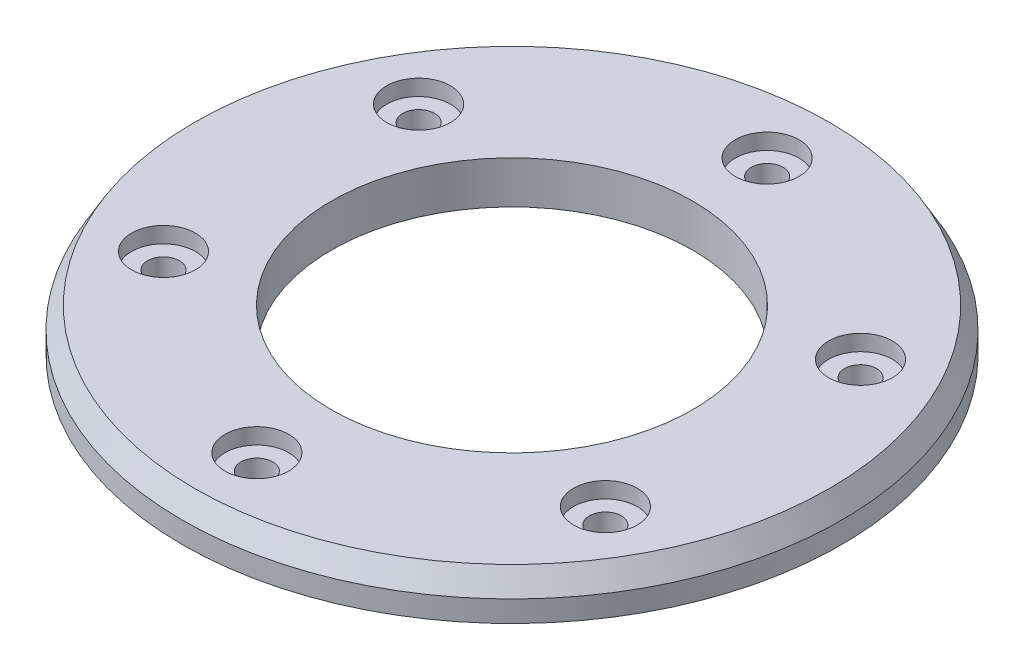
ISO-10303-21;
HEADER;
FILE_DESCRIPTION(('STEP AP214'),'2;1');
FILE_NAME('part.step','',(''),(''),'','','');
FILE_SCHEMA(('AUTOMOTIVE_DESIGN { 1 0 10303 214 1 1 1 1 }'));
ENDSEC;
DATA;
#1=APPLICATION_CONTEXT('core data for automotive mechanical design processes');
#2=APPLICATION_PROTOCOL_DEFINITION('international standard','automotive_design',2000,#1);
#3=PRODUCT_CONTEXT('',#1,'mechanical');
#4=PRODUCT('Part','Part','',(#3));
#5=PRODUCT_RELATED_PRODUCT_CATEGORY('part','',(#4));
#6=PRODUCT_DEFINITION_FORMATION('','',#4);
#7=PRODUCT_DEFINITION_CONTEXT('part definition',#1,'design');
#8=PRODUCT_DEFINITION('design','',#6,#7);
#9=PRODUCT_DEFINITION_SHAPE('','',#8);
#10=(LENGTH_UNIT() NAMED_UNIT(*) SI_UNIT(.MILLI.,.METRE.));
#11=(NAMED_UNIT(*) PLANE_ANGLE_UNIT() SI_UNIT($,.RADIAN.));
#12=(NAMED_UNIT(*) SI_UNIT($,.STERADIAN.) SOLID_ANGLE_UNIT());
#13=UNCERTAINTY_MEASURE_WITH_UNIT(LENGTH_MEASURE(1.E-05),#10,'distance_accuracy_value','');
#14=(GEOMETRIC_REPRESENTATION_CONTEXT(3) GLOBAL_UNCERTAINTY_ASSIGNED_CONTEXT((#13)) GLOBAL_UNIT_ASSIGNED_CONTEXT((#10,
#11,#12)) REPRESENTATION_CONTEXT('',''));
#15=CARTESIAN_POINT('',(0.,0.,0.));
#16=DIRECTION('',(0.,0.,1.));
#17=DIRECTION('',(1.,0.,0.));
#18=AXIS2_PLACEMENT_3D('',#15,#16,#17);
#19=CARTESIAN_POINT('',(0.,4.,-24.));
#20=DIRECTION('',(0.,-1.,0.));
#21=DIRECTION('',(0.,0.,-1.));
#22=AXIS2_PLACEMENT_3D('',#19,#20,#21);
#23=CYLINDRICAL_SURFACE('',#22,1.5);
#24=CARTESIAN_POINT('',(0.,0.,-24.));
#25=DIRECTION('',(0.,1.,0.));
#26=DIRECTION('',(0.,0.,1.));
#27=AXIS2_PLACEMENT_3D('',#24,#25,#26);
#28=CIRCLE('',#27,1.5);
#29=CARTESIAN_POINT('',(0.,0.,-22.5));
#30=VERTEX_POINT('',#29);
#31=EDGE_CURVE('E73',#30,#30,#28,.T.);
#32=ORIENTED_EDGE('',*,*,#31,.F.);
#33=EDGE_LOOP('',(#32));
#34=FACE_BOUND('',#33,.T.);
#35=CARTESIAN_POINT('',(0.,2.5,-24.));
#36=DIRECTION('',(0.,1.,0.));
#37=DIRECTION('',(0.,0.,1.));
#38=AXIS2_PLACEMENT_3D('',#35,#36,#37);
#39=CIRCLE('',#38,1.5);
#40=CARTESIAN_POINT('',(0.,2.5,-22.5));
#41=VERTEX_POINT('',#40);
#42=EDGE_CURVE('E50',#41,#41,#39,.T.);
#43=ORIENTED_EDGE('',*,*,#42,.T.);
#44=EDGE_LOOP('',(#43));
#45=FACE_BOUND('',#44,.T.);
#46=ADVANCED_FACE('F32',(#34,#45),#23,.F.);
#47=CARTESIAN_POINT('',(20.7846096908276,4.,-12.0000000000018));
#48=DIRECTION('',(0.,-1.,0.));
#49=DIRECTION('',(0.,0.,-1.));
#50=AXIS2_PLACEMENT_3D('',#47,#48,#49);
#51=CYLINDRICAL_SURFACE('',#50,1.5);
#52=CARTESIAN_POINT('',(20.7846096908276,0.,-12.0000000000018));
#53=DIRECTION('',(0.,1.,0.));
#54=DIRECTION('',(0.,0.,1.));
#55=AXIS2_PLACEMENT_3D('',#52,#53,#54);
#56=CIRCLE('',#55,1.5);
#57=CARTESIAN_POINT('',(20.7846096908276,0.,-10.5000000000018));
#58=VERTEX_POINT('',#57);
#59=EDGE_CURVE('E78',#58,#58,#56,.T.);
#60=ORIENTED_EDGE('',*,*,#59,.F.);
#61=EDGE_LOOP('',(#60));
#62=FACE_BOUND('',#61,.T.);
#63=CARTESIAN_POINT('',(20.7846096908276,2.5,-12.0000000000018));
#64=DIRECTION('',(0.,1.,0.));
#65=DIRECTION('',(0.,0.,1.));
#66=AXIS2_PLACEMENT_3D('',#63,#64,#65);
#67=CIRCLE('',#66,1.5);
#68=CARTESIAN_POINT('',(20.7846096908276,2.5,-10.5000000000018));
#69=VERTEX_POINT('',#68);
#70=EDGE_CURVE('E54',#69,#69,#67,.T.);
#71=ORIENTED_EDGE('',*,*,#70,.T.);
#72=EDGE_LOOP('',(#71));
#73=FACE_BOUND('',#72,.T.);
#74=ADVANCED_FACE('F199',(#62,#73),#51,.F.);
#75=CARTESIAN_POINT('',(20.7846096908297,4.,11.9999999999982));
#76=DIRECTION('',(0.,-1.,0.));
#77=DIRECTION('',(0.,0.,-1.));
#78=AXIS2_PLACEMENT_3D('',#75,#76,#77);
#79=CYLINDRICAL_SURFACE('',#78,1.5);
#80=CARTESIAN_POINT('',(20.7846096908297,0.,11.9999999999982));
#81=DIRECTION('',(0.,1.,0.));
#82=DIRECTION('',(0.,0.,1.));
#83=AXIS2_PLACEMENT_3D('',#80,#81,#82);
#84=CIRCLE('',#83,1.5);
#85=CARTESIAN_POINT('',(20.7846096908297,0.,13.4999999999982));
#86=VERTEX_POINT('',#85);
#87=EDGE_CURVE('E81',#86,#86,#84,.T.);
#88=ORIENTED_EDGE('',*,*,#87,.F.);
#89=EDGE_LOOP('',(#88));
#90=FACE_BOUND('',#89,.T.);
#91=CARTESIAN_POINT('',(20.7846096908297,2.5,11.9999999999982));
#92=DIRECTION('',(0.,1.,0.));
#93=DIRECTION('',(0.,0.,1.));
#94=AXIS2_PLACEMENT_3D('',#91,#92,#93);
#95=CIRCLE('',#94,1.5);
#96=CARTESIAN_POINT('',(20.7846096908297,2.5,13.4999999999982));
#97=VERTEX_POINT('',#96);
#98=EDGE_CURVE('E57',#97,#97,#95,.T.);
#99=ORIENTED_EDGE('',*,*,#98,.T.);
#100=EDGE_LOOP('',(#99));
#101=FACE_BOUND('',#100,.T.);
#102=ADVANCED_FACE('F205',(#90,#101),#79,.F.);
#103=CARTESIAN_POINT('',(4.17192928461361E-12,4.,24.));
#104=DIRECTION('',(0.,-1.,0.));
#105=DIRECTION('',(0.,0.,-1.));
#106=AXIS2_PLACEMENT_3D('',#103,#104,#105);
#107=CYLINDRICAL_SURFACE('',#106,1.5);
#108=CARTESIAN_POINT('',(4.17192928461361E-12,0.,24.));
#109=DIRECTION('',(0.,1.,0.));
#110=DIRECTION('',(0.,0.,1.));
#111=AXIS2_PLACEMENT_3D('',#108,#109,#110);
#112=CIRCLE('',#111,1.5);
#113=CARTESIAN_POINT('',(4.17192928461361E-12,0.,25.5));
#114=VERTEX_POINT('',#113);
#115=EDGE_CURVE('E84',#114,#114,#112,.T.);
#116=ORIENTED_EDGE('',*,*,#115,.F.);
#117=EDGE_LOOP('',(#116));
#118=FACE_BOUND('',#117,.T.);
#119=CARTESIAN_POINT('',(4.17192928461361E-12,2.5,24.));
#120=DIRECTION('',(0.,1.,0.));
#121=DIRECTION('',(0.,0.,1.));
#122=AXIS2_PLACEMENT_3D('',#119,#120,#121);
#123=CIRCLE('',#122,1.5);
#124=CARTESIAN_POINT('',(4.17192928461361E-12,2.5,25.5));
#125=VERTEX_POINT('',#124);
#126=EDGE_CURVE('E60',#125,#125,#123,.T.);
#127=ORIENTED_EDGE('',*,*,#126,.T.);
#128=EDGE_LOOP('',(#127));
#129=FACE_BOUND('',#128,.T.);
#130=ADVANCED_FACE('F246',(#118,#129),#107,.F.);
#131=CARTESIAN_POINT('',(-20.7846096908234,4.,12.0000000000018));
#132=DIRECTION('',(0.,-1.,0.));
#133=DIRECTION('',(0.,0.,-1.));
#134=AXIS2_PLACEMENT_3D('',#131,#132,#133);
#135=CYLINDRICAL_SURFACE('',#134,1.5);
#136=CARTESIAN_POINT('',(-20.7846096908234,0.,12.0000000000018));
#137=DIRECTION('',(0.,1.,0.));
#138=DIRECTION('',(0.,0.,1.));
#139=AXIS2_PLACEMENT_3D('',#136,#137,#138);
#140=CIRCLE('',#139,1.5);
#141=CARTESIAN_POINT('',(-20.7846096908234,0.,13.5000000000018));
#142=VERTEX_POINT('',#141);
#143=EDGE_CURVE('E87',#142,#142,#140,.T.);
#144=ORIENTED_EDGE('',*,*,#143,.F.);
#145=EDGE_LOOP('',(#144));
#146=FACE_BOUND('',#145,.T.);
#147=CARTESIAN_POINT('',(-20.7846096908234,2.5,12.0000000000018));
#148=DIRECTION('',(0.,1.,0.));
#149=DIRECTION('',(0.,0.,1.));
#150=AXIS2_PLACEMENT_3D('',#147,#148,#149);
#151=CIRCLE('',#150,1.5);
#152=CARTESIAN_POINT('',(-20.7846096908234,2.5,13.5000000000018));
#153=VERTEX_POINT('',#152);
#154=EDGE_CURVE('E63',#153,#153,#151,.T.);
#155=ORIENTED_EDGE('',*,*,#154,.T.);
#156=EDGE_LOOP('',(#155));
#157=FACE_BOUND('',#156,.T.);
#158=ADVANCED_FACE('F181',(#146,#157),#135,.F.);
#159=CARTESIAN_POINT('',(-20.7846096908255,4.,-11.9999999999982));
#160=DIRECTION('',(0.,-1.,0.));
#161=DIRECTION('',(0.,0.,-1.));
#162=AXIS2_PLACEMENT_3D('',#159,#160,#161);
#163=CYLINDRICAL_SURFACE('',#162,1.5);
#164=CARTESIAN_POINT('',(-20.7846096908255,0.,-11.9999999999982));
#165=DIRECTION('',(0.,1.,0.));
#166=DIRECTION('',(0.,0.,1.));
#167=AXIS2_PLACEMENT_3D('',#164,#165,#166);
#168=CIRCLE('',#167,1.5);
#169=CARTESIAN_POINT('',(-20.7846096908255,0.,-10.4999999999982));
#170=VERTEX_POINT('',#169);
#171=EDGE_CURVE('E53',#170,#170,#168,.T.);
#172=ORIENTED_EDGE('',*,*,#171,.F.);
#173=EDGE_LOOP('',(#172));
#174=FACE_BOUND('',#173,.T.);
#175=CARTESIAN_POINT('',(-20.7846096908255,2.5,-11.9999999999982));
#176=DIRECTION('',(0.,1.,0.));
#177=DIRECTION('',(0.,0.,1.));
#178=AXIS2_PLACEMENT_3D('',#175,#176,#177);
#179=CIRCLE('',#178,1.5);
#180=CARTESIAN_POINT('',(-20.7846096908255,2.5,-10.4999999999982));
#181=VERTEX_POINT('',#180);
#182=EDGE_CURVE('E66',#181,#181,#179,.T.);
#183=ORIENTED_EDGE('',*,*,#182,.T.);
#184=EDGE_LOOP('',(#183));
#185=FACE_BOUND('',#184,.T.);
#186=ADVANCED_FACE('F141',(#174,#185),#163,.F.);
#187=CARTESIAN_POINT('',(0.,4.,0.));
#188=DIRECTION('',(0.,1.,0.));
#189=DIRECTION('',(0.,0.,1.));
#190=AXIS2_PLACEMENT_3D('',#187,#188,#189);
#191=PLANE('',#190);
#192=CARTESIAN_POINT('',(0.,4.,0.));
#193=DIRECTION('',(0.,1.,0.));
#194=DIRECTION('',(0.,0.,1.));
#195=AXIS2_PLACEMENT_3D('',#192,#193,#194);
#196=CIRCLE('',#195,29.8452994616207);
#197=CARTESIAN_POINT('',(0.,4.,29.8452994616207));
#198=VERTEX_POINT('',#197);
#199=EDGE_CURVE('E39',#198,#198,#196,.T.);
#200=ORIENTED_EDGE('',*,*,#199,.T.);
#201=EDGE_LOOP('',(#200));
#202=FACE_BOUND('',#201,.T.);
#203=CARTESIAN_POINT('',(0.,4.,-24.));
#204=DIRECTION('',(0.,1.,0.));
#205=DIRECTION('',(0.,0.,1.));
#206=AXIS2_PLACEMENT_3D('',#203,#204,#205);
#207=CIRCLE('',#206,3.);
#208=CARTESIAN_POINT('',(0.,4.,-21.));
#209=VERTEX_POINT('',#208);
#210=EDGE_CURVE('E117',#209,#209,#207,.T.);
#211=ORIENTED_EDGE('',*,*,#210,.F.);
#212=EDGE_LOOP('',(#211));
#213=FACE_BOUND('',#212,.T.);
#214=CARTESIAN_POINT('',(-20.7846096908259,4.,-11.9999999999988));
#215=DIRECTION('',(0.,1.,0.));
#216=DIRECTION('',(0.,0.,1.));
#217=AXIS2_PLACEMENT_3D('',#214,#215,#216);
#218=CIRCLE('',#217,3.00000000000128);
#219=CARTESIAN_POINT('',(-20.7846096908259,4.,-8.99999999999753));
#220=VERTEX_POINT('',#219);
#221=EDGE_CURVE('E118',#220,#220,#218,.T.);
#222=ORIENTED_EDGE('',*,*,#221,.F.);
#223=EDGE_LOOP('',(#222));
#224=FACE_BOUND('',#223,.T.);
#225=CARTESIAN_POINT('',(-20.7846096908245,4.,12.0000000000012));
#226=DIRECTION('',(0.,1.,0.));
#227=DIRECTION('',(0.,0.,1.));
#228=AXIS2_PLACEMENT_3D('',#225,#226,#227);
#229=CIRCLE('',#228,3.00000000000251);
#230=CARTESIAN_POINT('',(-20.7846096908245,4.,15.0000000000037));
#231=VERTEX_POINT('',#230);
#232=EDGE_CURVE('E92',#231,#231,#229,.T.);
#233=ORIENTED_EDGE('',*,*,#232,.F.);
#234=EDGE_LOOP('',(#233));
#235=FACE_BOUND('',#234,.T.);
#236=CARTESIAN_POINT('',(2.72260580068288E-12,4.,24.));
#237=DIRECTION('',(0.,1.,0.));
#238=DIRECTION('',(0.,0.,1.));
#239=AXIS2_PLACEMENT_3D('',#236,#237,#238);
#240=CIRCLE('',#239,3.00000000000276);
#241=CARTESIAN_POINT('',(2.72260580068288E-12,4.,27.0000000000028));
#242=VERTEX_POINT('',#241);
#243=EDGE_CURVE('E99',#242,#242,#240,.T.);
#244=ORIENTED_EDGE('',*,*,#243,.F.);
#245=EDGE_LOOP('',(#244));
#246=FACE_BOUND('',#245,.T.);
#247=CARTESIAN_POINT('',(20.7846096908286,4.,11.9999999999988));
#248=DIRECTION('',(0.,1.,0.));
#249=DIRECTION('',(0.,0.,1.));
#250=AXIS2_PLACEMENT_3D('',#247,#248,#249);
#251=CIRCLE('',#250,3.00000000000172);
#252=CARTESIAN_POINT('',(20.7846096908286,4.,15.0000000000005));
#253=VERTEX_POINT('',#252);
#254=EDGE_CURVE('E105',#253,#253,#251,.T.);
#255=ORIENTED_EDGE('',*,*,#254,.F.);
#256=EDGE_LOOP('',(#255));
#257=FACE_BOUND('',#256,.T.);
#258=CARTESIAN_POINT('',(20.7846096908272,4.,-12.0000000000012));
#259=DIRECTION('',(0.,1.,0.));
#260=DIRECTION('',(0.,0.,1.));
#261=AXIS2_PLACEMENT_3D('',#258,#259,#260);
#262=CIRCLE('',#261,3.00000000000036);
#263=CARTESIAN_POINT('',(20.7846096908272,4.,-9.00000000000082));
#264=VERTEX_POINT('',#263);
#265=EDGE_CURVE('E111',#264,#264,#262,.T.);
#266=ORIENTED_EDGE('',*,*,#265,.F.);
#267=EDGE_LOOP('',(#266));
#268=FACE_BOUND('',#267,.T.);
#269=CARTESIAN_POINT('',(0.,4.,0.));
#270=DIRECTION('',(0.,1.,0.));
#271=DIRECTION('',(0.,0.,1.));
#272=AXIS2_PLACEMENT_3D('',#269,#270,#271);
#273=CIRCLE('',#272,17.);
#274=CARTESIAN_POINT('',(0.,4.,17.));
#275=VERTEX_POINT('',#274);
#276=EDGE_CURVE('E47',#275,#275,#273,.T.);
#277=ORIENTED_EDGE('',*,*,#276,.F.);
#278=EDGE_LOOP('',(#277));
#279=FACE_BOUND('',#278,.T.);
#280=ADVANCED_FACE('F137',(#202,#213,#224,#235,#246,#257,#268,#279),#191,.T.);
#281=CARTESIAN_POINT('',(0.,0.,0.));
#282=DIRECTION('',(0.,1.,0.));
#283=DIRECTION('',(0.,0.,1.));
#284=AXIS2_PLACEMENT_3D('',#281,#282,#283);
#285=PLANE('',#284);
#286=CARTESIAN_POINT('',(0.,0.,0.));
#287=DIRECTION('',(0.,1.,0.));
#288=DIRECTION('',(0.,0.,1.));
#289=AXIS2_PLACEMENT_3D('',#286,#287,#288);
#290=CIRCLE('',#289,31.);
#291=CARTESIAN_POINT('',(0.,0.,31.));
#292=VERTEX_POINT('',#291);
#293=EDGE_CURVE('E43',#292,#292,#290,.T.);
#294=ORIENTED_EDGE('',*,*,#293,.F.);
#295=EDGE_LOOP('',(#294));
#296=FACE_BOUND('',#295,.T.);
#297=CARTESIAN_POINT('',(0.,0.,0.));
#298=DIRECTION('',(0.,1.,0.));
#299=DIRECTION('',(0.,0.,1.));
#300=AXIS2_PLACEMENT_3D('',#297,#298,#299);
#301=CIRCLE('',#300,17.);
#302=CARTESIAN_POINT('',(0.,0.,17.));
#303=VERTEX_POINT('',#302);
#304=EDGE_CURVE('E70',#303,#303,#301,.T.);
#305=ORIENTED_EDGE('',*,*,#304,.T.);
#306=EDGE_LOOP('',(#305));
#307=FACE_BOUND('',#306,.T.);
#308=ORIENTED_EDGE('',*,*,#31,.T.);
#309=EDGE_LOOP('',(#308));
#310=FACE_BOUND('',#309,.T.);
#311=ORIENTED_EDGE('',*,*,#59,.T.);
#312=EDGE_LOOP('',(#311));
#313=FACE_BOUND('',#312,.T.);
#314=ORIENTED_EDGE('',*,*,#87,.T.);
#315=EDGE_LOOP('',(#314));
#316=FACE_BOUND('',#315,.T.);
#317=ORIENTED_EDGE('',*,*,#115,.T.);
#318=EDGE_LOOP('',(#317));
#319=FACE_BOUND('',#318,.T.);
#320=ORIENTED_EDGE('',*,*,#143,.T.);
#321=EDGE_LOOP('',(#320));
#322=FACE_BOUND('',#321,.T.);
#323=ORIENTED_EDGE('',*,*,#171,.T.);
#324=EDGE_LOOP('',(#323));
#325=FACE_BOUND('',#324,.T.);
#326=ADVANCED_FACE('F140',(#296,#307,#310,#313,#316,#319,#322,#325),#285,.F.);
#327=CARTESIAN_POINT('',(0.,4.,0.));
#328=DIRECTION('',(0.,-1.,0.));
#329=DIRECTION('',(0.,0.,-1.));
#330=AXIS2_PLACEMENT_3D('',#327,#328,#329);
#331=CYLINDRICAL_SURFACE('',#330,31.);
#332=CARTESIAN_POINT('',(0.,1.99999999999998,0.));
#333=DIRECTION('',(0.,1.,0.));
#334=DIRECTION('',(0.,0.,1.));
#335=AXIS2_PLACEMENT_3D('',#332,#333,#334);
#336=CIRCLE('',#335,31.);
#337=CARTESIAN_POINT('',(0.,1.99999999999998,31.));
#338=VERTEX_POINT('',#337);
#339=EDGE_CURVE('E10',#338,#338,#336,.F.);
#340=ORIENTED_EDGE('',*,*,#339,.T.);
#341=EDGE_LOOP('',(#340));
#342=FACE_BOUND('',#341,.T.);
#343=ORIENTED_EDGE('',*,*,#293,.T.);
#344=EDGE_LOOP('',(#343));
#345=FACE_BOUND('',#344,.T.);
#346=ADVANCED_FACE('F159',(#342,#345),#331,.T.);
#347=CARTESIAN_POINT('',(0.,4.,0.));
#348=DIRECTION('',(0.,-1.,0.));
#349=DIRECTION('',(0.,0.,-1.));
#350=AXIS2_PLACEMENT_3D('',#347,#348,#349);
#351=CYLINDRICAL_SURFACE('',#350,17.);
#352=ORIENTED_EDGE('',*,*,#276,.T.);
#353=EDGE_LOOP('',(#352));
#354=FACE_BOUND('',#353,.T.);
#355=ORIENTED_EDGE('',*,*,#304,.F.);
#356=EDGE_LOOP('',(#355));
#357=FACE_BOUND('',#356,.T.);
#358=ADVANCED_FACE('F155',(#354,#357),#351,.F.);
#359=CARTESIAN_POINT('',(-20.7846096908259,2.5,-11.9999999999988));
#360=DIRECTION('',(0.,1.,0.));
#361=DIRECTION('',(0.,0.,1.));
#362=AXIS2_PLACEMENT_3D('',#359,#360,#361);
#363=CYLINDRICAL_SURFACE('',#362,3.00000000000128);
#364=CARTESIAN_POINT('',(-20.7846096908259,2.5,-11.9999999999988));
#365=DIRECTION('',(0.,1.,0.));
#366=DIRECTION('',(0.,0.,1.));
#367=AXIS2_PLACEMENT_3D('',#364,#365,#366);
#368=CIRCLE('',#367,3.00000000000128);
#369=CARTESIAN_POINT('',(-20.7846096908259,2.5,-8.99999999999753));
#370=VERTEX_POINT('',#369);
#371=EDGE_CURVE('E96',#370,#370,#368,.T.);
#372=ORIENTED_EDGE('',*,*,#371,.F.);
#373=EDGE_LOOP('',(#372));
#374=FACE_BOUND('',#373,.T.);
#375=ORIENTED_EDGE('',*,*,#221,.T.);
#376=EDGE_LOOP('',(#375));
#377=FACE_BOUND('',#376,.T.);
#378=ADVANCED_FACE('F158',(#374,#377),#363,.F.);
#379=CARTESIAN_POINT('',(-20.7846096908259,2.5,-11.9999999999988));
#380=DIRECTION('',(0.,1.,0.));
#381=DIRECTION('',(0.,0.,1.));
#382=AXIS2_PLACEMENT_3D('',#379,#380,#381);
#383=PLANE('',#382);
#384=ORIENTED_EDGE('',*,*,#182,.F.);
#385=EDGE_LOOP('',(#384));
#386=FACE_BOUND('',#385,.T.);
#387=ORIENTED_EDGE('',*,*,#371,.T.);
#388=EDGE_LOOP('',(#387));
#389=FACE_BOUND('',#388,.T.);
#390=ADVANCED_FACE('F185',(#386,#389),#383,.T.);
#391=CARTESIAN_POINT('',(-20.7846096908245,2.5,12.0000000000012));
#392=DIRECTION('',(0.,1.,0.));
#393=DIRECTION('',(0.,0.,1.));
#394=AXIS2_PLACEMENT_3D('',#391,#392,#393);
#395=CYLINDRICAL_SURFACE('',#394,3.00000000000251);
#396=CARTESIAN_POINT('',(-20.7846096908245,2.5,12.0000000000012));
#397=DIRECTION('',(0.,1.,0.));
#398=DIRECTION('',(0.,0.,1.));
#399=AXIS2_PLACEMENT_3D('',#396,#397,#398);
#400=CIRCLE('',#399,3.00000000000251);
#401=CARTESIAN_POINT('',(-20.7846096908245,2.5,15.0000000000037));
#402=VERTEX_POINT('',#401);
#403=EDGE_CURVE('E95',#402,#402,#400,.T.);
#404=ORIENTED_EDGE('',*,*,#403,.F.);
#405=EDGE_LOOP('',(#404));
#406=FACE_BOUND('',#405,.T.);
#407=ORIENTED_EDGE('',*,*,#232,.T.);
#408=EDGE_LOOP('',(#407));
#409=FACE_BOUND('',#408,.T.);
#410=ADVANCED_FACE('F188',(#406,#409),#395,.F.);
#411=CARTESIAN_POINT('',(-20.7846096908245,2.5,12.0000000000012));
#412=DIRECTION('',(0.,1.,0.));
#413=DIRECTION('',(0.,0.,1.));
#414=AXIS2_PLACEMENT_3D('',#411,#412,#413);
#415=PLANE('',#414);
#416=ORIENTED_EDGE('',*,*,#154,.F.);
#417=EDGE_LOOP('',(#416));
#418=FACE_BOUND('',#417,.T.);
#419=ORIENTED_EDGE('',*,*,#403,.T.);
#420=EDGE_LOOP('',(#419));
#421=FACE_BOUND('',#420,.T.);
#422=ADVANCED_FACE('F287',(#418,#421),#415,.T.);
#423=CARTESIAN_POINT('',(2.72260580068288E-12,2.5,24.));
#424=DIRECTION('',(0.,1.,0.));
#425=DIRECTION('',(0.,0.,1.));
#426=AXIS2_PLACEMENT_3D('',#423,#424,#425);
#427=CYLINDRICAL_SURFACE('',#426,3.00000000000276);
#428=CARTESIAN_POINT('',(2.72260580068288E-12,2.5,24.));
#429=DIRECTION('',(0.,1.,0.));
#430=DIRECTION('',(0.,0.,1.));
#431=AXIS2_PLACEMENT_3D('',#428,#429,#430);
#432=CIRCLE('',#431,3.00000000000276);
#433=CARTESIAN_POINT('',(2.72260580068288E-12,2.5,27.0000000000028));
#434=VERTEX_POINT('',#433);
#435=EDGE_CURVE('E102',#434,#434,#432,.T.);
#436=ORIENTED_EDGE('',*,*,#435,.F.);
#437=EDGE_LOOP('',(#436));
#438=FACE_BOUND('',#437,.T.);
#439=ORIENTED_EDGE('',*,*,#243,.T.);
#440=EDGE_LOOP('',(#439));
#441=FACE_BOUND('',#440,.T.);
#442=ADVANCED_FACE('F297',(#438,#441),#427,.F.);
#443=CARTESIAN_POINT('',(2.72260580068288E-12,2.5,24.));
#444=DIRECTION('',(0.,1.,0.));
#445=DIRECTION('',(0.,0.,1.));
#446=AXIS2_PLACEMENT_3D('',#443,#444,#445);
#447=PLANE('',#446);
#448=ORIENTED_EDGE('',*,*,#126,.F.);
#449=EDGE_LOOP('',(#448));
#450=FACE_BOUND('',#449,.T.);
#451=ORIENTED_EDGE('',*,*,#435,.T.);
#452=EDGE_LOOP('',(#451));
#453=FACE_BOUND('',#452,.T.);
#454=ADVANCED_FACE('F307',(#450,#453),#447,.T.);
#455=CARTESIAN_POINT('',(20.7846096908286,2.5,11.9999999999988));
#456=DIRECTION('',(0.,1.,0.));
#457=DIRECTION('',(0.,0.,1.));
#458=AXIS2_PLACEMENT_3D('',#455,#456,#457);
#459=CYLINDRICAL_SURFACE('',#458,3.00000000000172);
#460=CARTESIAN_POINT('',(20.7846096908286,2.5,11.9999999999988));
#461=DIRECTION('',(0.,1.,0.));
#462=DIRECTION('',(0.,0.,1.));
#463=AXIS2_PLACEMENT_3D('',#460,#461,#462);
#464=CIRCLE('',#463,3.00000000000172);
#465=CARTESIAN_POINT('',(20.7846096908286,2.5,15.0000000000005));
#466=VERTEX_POINT('',#465);
#467=EDGE_CURVE('E108',#466,#466,#464,.T.);
#468=ORIENTED_EDGE('',*,*,#467,.F.);
#469=EDGE_LOOP('',(#468));
#470=FACE_BOUND('',#469,.T.);
#471=ORIENTED_EDGE('',*,*,#254,.T.);
#472=EDGE_LOOP('',(#471));
#473=FACE_BOUND('',#472,.T.);
#474=ADVANCED_FACE('F317',(#470,#473),#459,.F.);
#475=CARTESIAN_POINT('',(20.7846096908286,2.5,11.9999999999988));
#476=DIRECTION('',(0.,1.,0.));
#477=DIRECTION('',(0.,0.,1.));
#478=AXIS2_PLACEMENT_3D('',#475,#476,#477);
#479=PLANE('',#478);
#480=ORIENTED_EDGE('',*,*,#98,.F.);
#481=EDGE_LOOP('',(#480));
#482=FACE_BOUND('',#481,.T.);
#483=ORIENTED_EDGE('',*,*,#467,.T.);
#484=EDGE_LOOP('',(#483));
#485=FACE_BOUND('',#484,.T.);
#486=ADVANCED_FACE('F327',(#482,#485),#479,.T.);
#487=CARTESIAN_POINT('',(20.7846096908272,2.5,-12.0000000000012));
#488=DIRECTION('',(0.,1.,0.));
#489=DIRECTION('',(0.,0.,1.));
#490=AXIS2_PLACEMENT_3D('',#487,#488,#489);
#491=CYLINDRICAL_SURFACE('',#490,3.00000000000036);
#492=CARTESIAN_POINT('',(20.7846096908272,2.5,-12.0000000000012));
#493=DIRECTION('',(0.,1.,0.));
#494=DIRECTION('',(0.,0.,1.));
#495=AXIS2_PLACEMENT_3D('',#492,#493,#494);
#496=CIRCLE('',#495,3.00000000000036);
#497=CARTESIAN_POINT('',(20.7846096908272,2.5,-9.00000000000082));
#498=VERTEX_POINT('',#497);
#499=EDGE_CURVE('E114',#498,#498,#496,.T.);
#500=ORIENTED_EDGE('',*,*,#499,.F.);
#501=EDGE_LOOP('',(#500));
#502=FACE_BOUND('',#501,.T.);
#503=ORIENTED_EDGE('',*,*,#265,.T.);
#504=EDGE_LOOP('',(#503));
#505=FACE_BOUND('',#504,.T.);
#506=ADVANCED_FACE('F337',(#502,#505),#491,.F.);
#507=CARTESIAN_POINT('',(20.7846096908272,2.5,-12.0000000000012));
#508=DIRECTION('',(0.,1.,0.));
#509=DIRECTION('',(0.,0.,1.));
#510=AXIS2_PLACEMENT_3D('',#507,#508,#509);
#511=PLANE('',#510);
#512=ORIENTED_EDGE('',*,*,#70,.F.);
#513=EDGE_LOOP('',(#512));
#514=FACE_BOUND('',#513,.T.);
#515=ORIENTED_EDGE('',*,*,#499,.T.);
#516=EDGE_LOOP('',(#515));
#517=FACE_BOUND('',#516,.T.);
#518=ADVANCED_FACE('F133',(#514,#517),#511,.T.);
#519=CARTESIAN_POINT('',(0.,2.5,-24.));
#520=DIRECTION('',(0.,1.,0.));
#521=DIRECTION('',(0.,0.,1.));
#522=AXIS2_PLACEMENT_3D('',#519,#520,#521);
#523=CYLINDRICAL_SURFACE('',#522,3.);
#524=CARTESIAN_POINT('',(0.,2.5,-24.));
#525=DIRECTION('',(0.,1.,0.));
#526=DIRECTION('',(0.,0.,1.));
#527=AXIS2_PLACEMENT_3D('',#524,#525,#526);
#528=CIRCLE('',#527,3.);
#529=CARTESIAN_POINT('',(0.,2.5,-21.));
#530=VERTEX_POINT('',#529);
#531=EDGE_CURVE('E68',#530,#530,#528,.T.);
#532=ORIENTED_EDGE('',*,*,#531,.F.);
#533=EDGE_LOOP('',(#532));
#534=FACE_BOUND('',#533,.T.);
#535=ORIENTED_EDGE('',*,*,#210,.T.);
#536=EDGE_LOOP('',(#535));
#537=FACE_BOUND('',#536,.T.);
#538=ADVANCED_FACE('F130',(#534,#537),#523,.F.);
#539=CARTESIAN_POINT('',(0.,2.5,-24.));
#540=DIRECTION('',(0.,1.,0.));
#541=DIRECTION('',(0.,0.,1.));
#542=AXIS2_PLACEMENT_3D('',#539,#540,#541);
#543=PLANE('',#542);
#544=ORIENTED_EDGE('',*,*,#42,.F.);
#545=EDGE_LOOP('',(#544));
#546=FACE_BOUND('',#545,.T.);
#547=ORIENTED_EDGE('',*,*,#531,.T.);
#548=EDGE_LOOP('',(#547));
#549=FACE_BOUND('',#548,.T.);
#550=ADVANCED_FACE('F128',(#546,#549),#543,.T.);
#551=CARTESIAN_POINT('',(0.,4.,0.));
#552=DIRECTION('',(0.,-1.,0.));
#553=DIRECTION('',(0.,0.,-1.));
#554=AXIS2_PLACEMENT_3D('',#551,#552,#553);
#555=CONICAL_SURFACE('',#554,29.8452994616207,0.523598775598301);
#556=ORIENTED_EDGE('',*,*,#339,.F.);
#557=EDGE_LOOP('',(#556));
#558=FACE_BOUND('',#557,.T.);
#559=ORIENTED_EDGE('',*,*,#199,.F.);
#560=EDGE_LOOP('',(#559));
#561=FACE_BOUND('',#560,.T.);
#562=ADVANCED_FACE('F34',(#558,#561),#555,.T.);
#563=CLOSED_SHELL('',(#46,#74,#102,#130,#158,#186,#280,#326,#346,#358,#378,#390,#410,#422,#442,
#454,#474,#486,#506,#518,#538,#550,#562));
#564=MANIFOLD_SOLID_BREP('B2',#563);
#565=ADVANCED_BREP_SHAPE_REPRESENTATION('',(#18,#564),#14);
#566=SHAPE_DEFINITION_REPRESENTATION(#9,#565);
ENDSEC;
END-ISO-10303-21;
